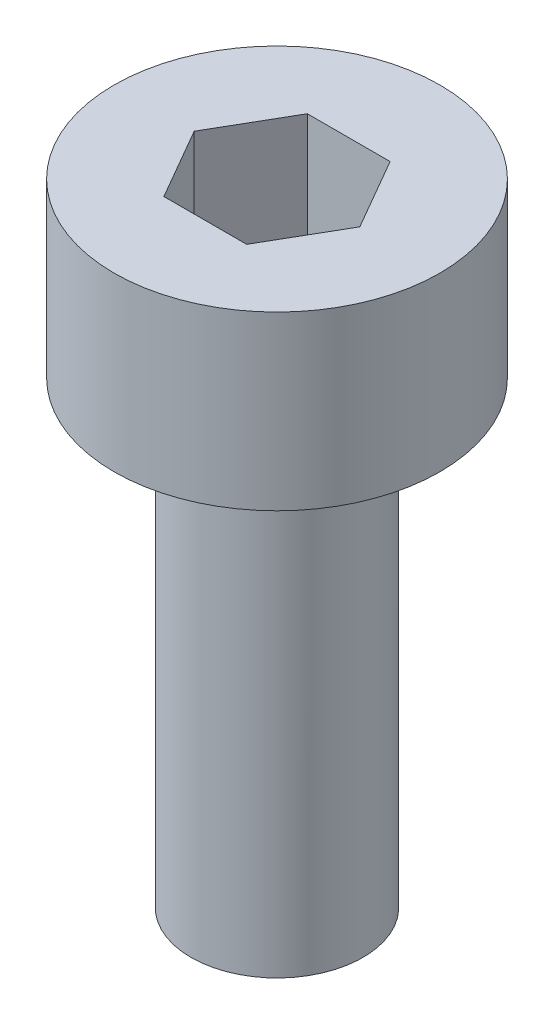
ISO-10303-21;
HEADER;
FILE_DESCRIPTION(('STEP AP214'),'2;1');
FILE_NAME('part.step','',(''),(''),'','','');
FILE_SCHEMA(('AUTOMOTIVE_DESIGN { 1 0 10303 214 1 1 1 1 }'));
ENDSEC;
DATA;
#1=APPLICATION_CONTEXT('core data for automotive mechanical design processes');
#2=APPLICATION_PROTOCOL_DEFINITION('international standard','automotive_design',2000,#1);
#3=PRODUCT_CONTEXT('',#1,'mechanical');
#4=PRODUCT('Part','Part','',(#3));
#5=PRODUCT_RELATED_PRODUCT_CATEGORY('part','',(#4));
#6=PRODUCT_DEFINITION_FORMATION('','',#4);
#7=PRODUCT_DEFINITION_CONTEXT('part definition',#1,'design');
#8=PRODUCT_DEFINITION('design','',#6,#7);
#9=PRODUCT_DEFINITION_SHAPE('','',#8);
#10=(LENGTH_UNIT() NAMED_UNIT(*) SI_UNIT(.MILLI.,.METRE.));
#11=(NAMED_UNIT(*) PLANE_ANGLE_UNIT() SI_UNIT($,.RADIAN.));
#12=(NAMED_UNIT(*) SI_UNIT($,.STERADIAN.) SOLID_ANGLE_UNIT());
#13=UNCERTAINTY_MEASURE_WITH_UNIT(LENGTH_MEASURE(1.E-05),#10,'distance_accuracy_value','');
#14=(GEOMETRIC_REPRESENTATION_CONTEXT(3) GLOBAL_UNCERTAINTY_ASSIGNED_CONTEXT((#13)) GLOBAL_UNIT_ASSIGNED_CONTEXT((#10,
#11,#12)) REPRESENTATION_CONTEXT('',''));
#15=CARTESIAN_POINT('',(0.,0.,0.));
#16=DIRECTION('',(0.,0.,1.));
#17=DIRECTION('',(1.,0.,0.));
#18=AXIS2_PLACEMENT_3D('',#15,#16,#17);
#19=CARTESIAN_POINT('',(0.,3.,0.));
#20=DIRECTION('',(0.,1.,0.));
#21=DIRECTION('',(0.,0.,1.));
#22=AXIS2_PLACEMENT_3D('',#19,#20,#21);
#23=PLANE('',#22);
#24=CARTESIAN_POINT('',(0.,3.,0.));
#25=DIRECTION('',(0.,1.,0.));
#26=DIRECTION('',(0.,0.,1.));
#27=AXIS2_PLACEMENT_3D('',#24,#25,#26);
#28=CIRCLE('',#27,2.84);
#29=CARTESIAN_POINT('',(0.,3.,2.84));
#30=VERTEX_POINT('',#29);
#31=EDGE_CURVE('E48',#30,#30,#28,.T.);
#32=ORIENTED_EDGE('',*,*,#31,.T.);
#33=EDGE_LOOP('',(#32));
#34=FACE_BOUND('',#33,.T.);
#35=DIRECTION('',(-1.,0.,0.));
#36=VECTOR('',#35,1.);
#37=CARTESIAN_POINT('',(0.721687836487032,3.,-1.25));
#38=LINE('',#37,#36);
#39=CARTESIAN_POINT('',(0.721687836487032,3.,-1.25));
#40=VERTEX_POINT('',#39);
#41=CARTESIAN_POINT('',(-0.721687836487032,3.,-1.25));
#42=VERTEX_POINT('',#41);
#43=EDGE_CURVE('E111',#40,#42,#38,.T.);
#44=ORIENTED_EDGE('',*,*,#43,.F.);
#45=DIRECTION('',(-0.5,0.,-0.866025403784438));
#46=VECTOR('',#45,1.);
#47=CARTESIAN_POINT('',(1.44337567297406,3.,0.));
#48=LINE('',#47,#46);
#49=CARTESIAN_POINT('',(1.44337567297406,3.,0.));
#50=VERTEX_POINT('',#49);
#51=EDGE_CURVE('E90',#50,#40,#48,.T.);
#52=ORIENTED_EDGE('',*,*,#51,.F.);
#53=DIRECTION('',(0.5,0.,-0.866025403784439));
#54=VECTOR('',#53,1.);
#55=CARTESIAN_POINT('',(0.721687836487032,3.,1.25));
#56=LINE('',#55,#54);
#57=CARTESIAN_POINT('',(0.721687836487032,3.,1.25));
#58=VERTEX_POINT('',#57);
#59=EDGE_CURVE('E61',#58,#50,#56,.T.);
#60=ORIENTED_EDGE('',*,*,#59,.F.);
#61=DIRECTION('',(1.,0.,0.));
#62=VECTOR('',#61,1.);
#63=CARTESIAN_POINT('',(-0.721687836487032,3.,1.25));
#64=LINE('',#63,#62);
#65=CARTESIAN_POINT('',(-0.721687836487032,3.,1.25));
#66=VERTEX_POINT('',#65);
#67=EDGE_CURVE('E123',#66,#58,#64,.T.);
#68=ORIENTED_EDGE('',*,*,#67,.F.);
#69=DIRECTION('',(0.5,0.,0.866025403784439));
#70=VECTOR('',#69,1.);
#71=CARTESIAN_POINT('',(-1.44337567297406,3.,0.));
#72=LINE('',#71,#70);
#73=CARTESIAN_POINT('',(-1.44337567297406,3.,0.));
#74=VERTEX_POINT('',#73);
#75=EDGE_CURVE('E110',#74,#66,#72,.T.);
#76=ORIENTED_EDGE('',*,*,#75,.F.);
#77=DIRECTION('',(-0.5,0.,0.866025403784439));
#78=VECTOR('',#77,1.);
#79=CARTESIAN_POINT('',(-0.721687836487032,3.,-1.25));
#80=LINE('',#79,#78);
#81=EDGE_CURVE('E99',#42,#74,#80,.T.);
#82=ORIENTED_EDGE('',*,*,#81,.F.);
#83=EDGE_LOOP('',(#44,#52,#60,#68,#76,#82));
#84=FACE_BOUND('',#83,.T.);
#85=ADVANCED_FACE('F39',(#34,#84),#23,.T.);
#86=CARTESIAN_POINT('',(0.,0.,0.));
#87=DIRECTION('',(0.,1.,0.));
#88=DIRECTION('',(0.,0.,1.));
#89=AXIS2_PLACEMENT_3D('',#86,#87,#88);
#90=PLANE('',#89);
#91=CARTESIAN_POINT('',(0.,0.,0.));
#92=DIRECTION('',(0.,1.,0.));
#93=DIRECTION('',(0.,0.,1.));
#94=AXIS2_PLACEMENT_3D('',#91,#92,#93);
#95=CIRCLE('',#94,1.5);
#96=CARTESIAN_POINT('',(0.,0.,1.5));
#97=VERTEX_POINT('',#96);
#98=EDGE_CURVE('E11',#97,#97,#95,.F.);
#99=ORIENTED_EDGE('',*,*,#98,.F.);
#100=EDGE_LOOP('',(#99));
#101=FACE_BOUND('',#100,.T.);
#102=CARTESIAN_POINT('',(0.,0.,0.));
#103=DIRECTION('',(0.,1.,0.));
#104=DIRECTION('',(0.,0.,1.));
#105=AXIS2_PLACEMENT_3D('',#102,#103,#104);
#106=CIRCLE('',#105,2.84);
#107=CARTESIAN_POINT('',(0.,0.,2.84));
#108=VERTEX_POINT('',#107);
#109=EDGE_CURVE('E166',#108,#108,#106,.T.);
#110=ORIENTED_EDGE('',*,*,#109,.F.);
#111=EDGE_LOOP('',(#110));
#112=FACE_BOUND('',#111,.T.);
#113=ADVANCED_FACE('F174',(#101,#112),#90,.F.);
#114=CARTESIAN_POINT('',(0.,3.,0.));
#115=DIRECTION('',(0.,-1.,0.));
#116=DIRECTION('',(0.,0.,-1.));
#117=AXIS2_PLACEMENT_3D('',#114,#115,#116);
#118=CYLINDRICAL_SURFACE('',#117,2.84);
#119=ORIENTED_EDGE('',*,*,#31,.F.);
#120=EDGE_LOOP('',(#119));
#121=FACE_BOUND('',#120,.T.);
#122=ORIENTED_EDGE('',*,*,#109,.T.);
#123=EDGE_LOOP('',(#122));
#124=FACE_BOUND('',#123,.T.);
#125=ADVANCED_FACE('F41',(#121,#124),#118,.T.);
#126=CARTESIAN_POINT('',(1.44337567297406,3.,0.));
#127=DIRECTION('',(-0.866025403784439,0.,0.5));
#128=DIRECTION('',(0.5,0.,0.866025403784439));
#129=AXIS2_PLACEMENT_3D('',#126,#127,#128);
#130=PLANE('',#129);
#131=DIRECTION('',(-0.5,0.,-0.866025403784438));
#132=VECTOR('',#131,1.);
#133=CARTESIAN_POINT('',(1.44337567297406,0.,0.));
#134=LINE('',#133,#132);
#135=CARTESIAN_POINT('',(1.44337567297406,0.,0.));
#136=VERTEX_POINT('',#135);
#137=CARTESIAN_POINT('',(0.721687836487032,0.,-1.25));
#138=VERTEX_POINT('',#137);
#139=EDGE_CURVE('E133',#136,#138,#134,.T.);
#140=ORIENTED_EDGE('',*,*,#139,.F.);
#141=DIRECTION('',(0.,-1.,0.));
#142=VECTOR('',#141,1.);
#143=CARTESIAN_POINT('',(1.44337567297406,3.,0.));
#144=LINE('',#143,#142);
#145=EDGE_CURVE('E132',#50,#136,#144,.T.);
#146=ORIENTED_EDGE('',*,*,#145,.F.);
#147=ORIENTED_EDGE('',*,*,#51,.T.);
#148=DIRECTION('',(0.,-1.,0.));
#149=VECTOR('',#148,1.);
#150=CARTESIAN_POINT('',(0.721687836487032,3.,-1.25));
#151=LINE('',#150,#149);
#152=EDGE_CURVE('E163',#40,#138,#151,.T.);
#153=ORIENTED_EDGE('',*,*,#152,.T.);
#154=EDGE_LOOP('',(#140,#146,#147,#153));
#155=FACE_BOUND('',#154,.T.);
#156=ADVANCED_FACE('F181',(#155),#130,.T.);
#157=CARTESIAN_POINT('',(0.721687836487032,3.,-1.25));
#158=DIRECTION('',(0.,0.,1.));
#159=DIRECTION('',(1.,0.,0.));
#160=AXIS2_PLACEMENT_3D('',#157,#158,#159);
#161=PLANE('',#160);
#162=DIRECTION('',(-1.,0.,0.));
#163=VECTOR('',#162,1.);
#164=CARTESIAN_POINT('',(0.721687836487032,0.,-1.25));
#165=LINE('',#164,#163);
#166=CARTESIAN_POINT('',(-0.721687836487032,0.,-1.25));
#167=VERTEX_POINT('',#166);
#168=EDGE_CURVE('E137',#138,#167,#165,.T.);
#169=ORIENTED_EDGE('',*,*,#168,.F.);
#170=ORIENTED_EDGE('',*,*,#152,.F.);
#171=ORIENTED_EDGE('',*,*,#43,.T.);
#172=DIRECTION('',(0.,-1.,0.));
#173=VECTOR('',#172,1.);
#174=CARTESIAN_POINT('',(-0.721687836487032,3.,-1.25));
#175=LINE('',#174,#173);
#176=EDGE_CURVE('E105',#42,#167,#175,.T.);
#177=ORIENTED_EDGE('',*,*,#176,.T.);
#178=EDGE_LOOP('',(#169,#170,#171,#177));
#179=FACE_BOUND('',#178,.T.);
#180=ADVANCED_FACE('F189',(#179),#161,.T.);
#181=CARTESIAN_POINT('',(-0.721687836487032,3.,-1.25));
#182=DIRECTION('',(0.866025403784439,0.,0.5));
#183=DIRECTION('',(0.5,0.,-0.866025403784439));
#184=AXIS2_PLACEMENT_3D('',#181,#182,#183);
#185=PLANE('',#184);
#186=DIRECTION('',(-0.5,0.,0.866025403784439));
#187=VECTOR('',#186,1.);
#188=CARTESIAN_POINT('',(-0.721687836487032,0.,-1.25));
#189=LINE('',#188,#187);
#190=CARTESIAN_POINT('',(-1.44337567297406,0.,0.));
#191=VERTEX_POINT('',#190);
#192=EDGE_CURVE('E142',#167,#191,#189,.T.);
#193=ORIENTED_EDGE('',*,*,#192,.F.);
#194=ORIENTED_EDGE('',*,*,#176,.F.);
#195=ORIENTED_EDGE('',*,*,#81,.T.);
#196=DIRECTION('',(0.,-1.,0.));
#197=VECTOR('',#196,1.);
#198=CARTESIAN_POINT('',(-1.44337567297406,3.,0.));
#199=LINE('',#198,#197);
#200=EDGE_CURVE('E103',#74,#191,#199,.T.);
#201=ORIENTED_EDGE('',*,*,#200,.T.);
#202=EDGE_LOOP('',(#193,#194,#195,#201));
#203=FACE_BOUND('',#202,.T.);
#204=ADVANCED_FACE('F102',(#203),#185,.T.);
#205=CARTESIAN_POINT('',(-1.44337567297406,3.,0.));
#206=DIRECTION('',(0.866025403784439,0.,-0.5));
#207=DIRECTION('',(-0.5,0.,-0.866025403784439));
#208=AXIS2_PLACEMENT_3D('',#205,#206,#207);
#209=PLANE('',#208);
#210=DIRECTION('',(0.5,0.,0.866025403784439));
#211=VECTOR('',#210,1.);
#212=CARTESIAN_POINT('',(-1.44337567297406,0.,0.));
#213=LINE('',#212,#211);
#214=CARTESIAN_POINT('',(-0.721687836487032,0.,1.25));
#215=VERTEX_POINT('',#214);
#216=EDGE_CURVE('E117',#191,#215,#213,.T.);
#217=ORIENTED_EDGE('',*,*,#216,.F.);
#218=ORIENTED_EDGE('',*,*,#200,.F.);
#219=ORIENTED_EDGE('',*,*,#75,.T.);
#220=DIRECTION('',(0.,-1.,0.));
#221=VECTOR('',#220,1.);
#222=CARTESIAN_POINT('',(-0.721687836487032,3.,1.25));
#223=LINE('',#222,#221);
#224=EDGE_CURVE('E120',#66,#215,#223,.T.);
#225=ORIENTED_EDGE('',*,*,#224,.T.);
#226=EDGE_LOOP('',(#217,#218,#219,#225));
#227=FACE_BOUND('',#226,.T.);
#228=ADVANCED_FACE('F114',(#227),#209,.T.);
#229=CARTESIAN_POINT('',(-0.721687836487032,3.,1.25));
#230=DIRECTION('',(0.,0.,-1.));
#231=DIRECTION('',(-1.,0.,0.));
#232=AXIS2_PLACEMENT_3D('',#229,#230,#231);
#233=PLANE('',#232);
#234=DIRECTION('',(1.,0.,0.));
#235=VECTOR('',#234,1.);
#236=CARTESIAN_POINT('',(-0.721687836487032,0.,1.25));
#237=LINE('',#236,#235);
#238=CARTESIAN_POINT('',(0.721687836487032,0.,1.25));
#239=VERTEX_POINT('',#238);
#240=EDGE_CURVE('E147',#215,#239,#237,.T.);
#241=ORIENTED_EDGE('',*,*,#240,.F.);
#242=ORIENTED_EDGE('',*,*,#224,.F.);
#243=ORIENTED_EDGE('',*,*,#67,.T.);
#244=DIRECTION('',(0.,-1.,0.));
#245=VECTOR('',#244,1.);
#246=CARTESIAN_POINT('',(0.721687836487032,3.,1.25));
#247=LINE('',#246,#245);
#248=EDGE_CURVE('E55',#58,#239,#247,.T.);
#249=ORIENTED_EDGE('',*,*,#248,.T.);
#250=EDGE_LOOP('',(#241,#242,#243,#249));
#251=FACE_BOUND('',#250,.T.);
#252=ADVANCED_FACE('F197',(#251),#233,.T.);
#253=CARTESIAN_POINT('',(0.721687836487032,3.,1.25));
#254=DIRECTION('',(-0.866025403784439,0.,-0.5));
#255=DIRECTION('',(-0.5,0.,0.866025403784439));
#256=AXIS2_PLACEMENT_3D('',#253,#254,#255);
#257=PLANE('',#256);
#258=DIRECTION('',(0.5,0.,-0.866025403784439));
#259=VECTOR('',#258,1.);
#260=CARTESIAN_POINT('',(0.721687836487032,0.,1.25));
#261=LINE('',#260,#259);
#262=EDGE_CURVE('E151',#239,#136,#261,.T.);
#263=ORIENTED_EDGE('',*,*,#262,.F.);
#264=ORIENTED_EDGE('',*,*,#248,.F.);
#265=ORIENTED_EDGE('',*,*,#59,.T.);
#266=ORIENTED_EDGE('',*,*,#145,.T.);
#267=EDGE_LOOP('',(#263,#264,#265,#266));
#268=FACE_BOUND('',#267,.T.);
#269=ADVANCED_FACE('F200',(#268),#257,.T.);
#270=CARTESIAN_POINT('',(0.,0.,0.));
#271=DIRECTION('',(0.,-1.,0.));
#272=DIRECTION('',(0.,0.,-1.));
#273=AXIS2_PLACEMENT_3D('',#270,#271,#272);
#274=PLANE('',#273);
#275=ORIENTED_EDGE('',*,*,#139,.T.);
#276=ORIENTED_EDGE('',*,*,#168,.T.);
#277=ORIENTED_EDGE('',*,*,#192,.T.);
#278=ORIENTED_EDGE('',*,*,#216,.T.);
#279=ORIENTED_EDGE('',*,*,#240,.T.);
#280=ORIENTED_EDGE('',*,*,#262,.T.);
#281=EDGE_LOOP('',(#275,#276,#277,#278,#279,#280));
#282=FACE_BOUND('',#281,.T.);
#283=ADVANCED_FACE('F203',(#282),#274,.F.);
#284=CARTESIAN_POINT('',(0.,-8.,0.));
#285=DIRECTION('',(0.,1.,0.));
#286=DIRECTION('',(0.,0.,1.));
#287=AXIS2_PLACEMENT_3D('',#284,#285,#286);
#288=CYLINDRICAL_SURFACE('',#287,1.5);
#289=CARTESIAN_POINT('',(0.,-8.,0.));
#290=DIRECTION('',(0.,-1.,0.));
#291=DIRECTION('',(0.,0.,-1.));
#292=AXIS2_PLACEMENT_3D('',#289,#290,#291);
#293=CIRCLE('',#292,1.5);
#294=CARTESIAN_POINT('',(0.,-8.,-1.5));
#295=VERTEX_POINT('',#294);
#296=EDGE_CURVE('E138',#295,#295,#293,.T.);
#297=ORIENTED_EDGE('',*,*,#296,.F.);
#298=EDGE_LOOP('',(#297));
#299=FACE_BOUND('',#298,.T.);
#300=ORIENTED_EDGE('',*,*,#98,.T.);
#301=EDGE_LOOP('',(#300));
#302=FACE_BOUND('',#301,.T.);
#303=ADVANCED_FACE('F204',(#299,#302),#288,.T.);
#304=CARTESIAN_POINT('',(0.,-8.,0.));
#305=DIRECTION('',(0.,-1.,0.));
#306=DIRECTION('',(0.,0.,-1.));
#307=AXIS2_PLACEMENT_3D('',#304,#305,#306);
#308=PLANE('',#307);
#309=ORIENTED_EDGE('',*,*,#296,.T.);
#310=EDGE_LOOP('',(#309));
#311=FACE_BOUND('',#310,.T.);
#312=ADVANCED_FACE('F207',(#311),#308,.T.);
#313=CLOSED_SHELL('',(#85,#113,#125,#156,#180,#204,#228,#252,#269,#283,#303,#312));
#314=MANIFOLD_SOLID_BREP('B2',#313);
#315=ADVANCED_BREP_SHAPE_REPRESENTATION('',(#18,#314),#14);
#316=SHAPE_DEFINITION_REPRESENTATION(#9,#315);
ENDSEC;
END-ISO-10303-21;
